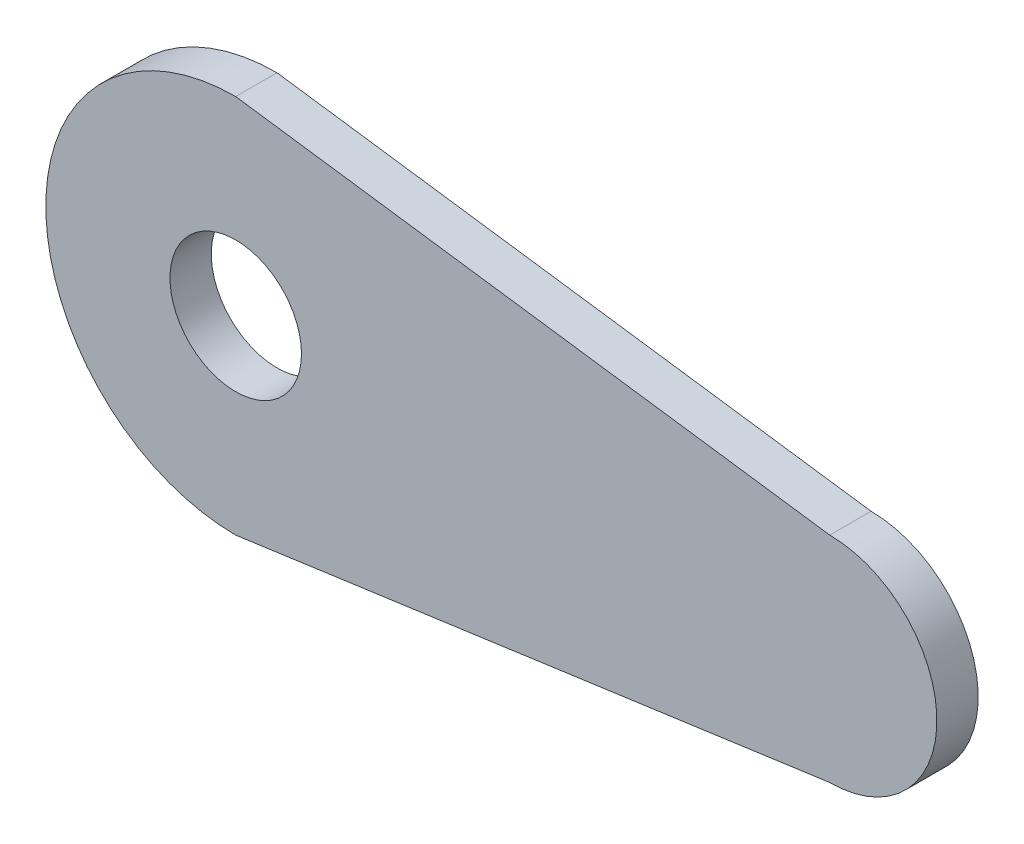
ISO-10303-21;
HEADER;
FILE_DESCRIPTION(('STEP AP214'),'2;1');
FILE_NAME('part.step','',(''),(''),'','','');
FILE_SCHEMA(('AUTOMOTIVE_DESIGN { 1 0 10303 214 1 1 1 1 }'));
ENDSEC;
DATA;
#1=APPLICATION_CONTEXT('core data for automotive mechanical design processes');
#2=APPLICATION_PROTOCOL_DEFINITION('international standard','automotive_design',2000,#1);
#3=PRODUCT_CONTEXT('',#1,'mechanical');
#4=PRODUCT('Part','Part','',(#3));
#5=PRODUCT_RELATED_PRODUCT_CATEGORY('part','',(#4));
#6=PRODUCT_DEFINITION_FORMATION('','',#4);
#7=PRODUCT_DEFINITION_CONTEXT('part definition',#1,'design');
#8=PRODUCT_DEFINITION('design','',#6,#7);
#9=PRODUCT_DEFINITION_SHAPE('','',#8);
#10=(LENGTH_UNIT() NAMED_UNIT(*) SI_UNIT(.MILLI.,.METRE.));
#11=(NAMED_UNIT(*) PLANE_ANGLE_UNIT() SI_UNIT($,.RADIAN.));
#12=(NAMED_UNIT(*) SI_UNIT($,.STERADIAN.) SOLID_ANGLE_UNIT());
#13=UNCERTAINTY_MEASURE_WITH_UNIT(LENGTH_MEASURE(1.E-05),#10,'distance_accuracy_value','');
#14=(GEOMETRIC_REPRESENTATION_CONTEXT(3) GLOBAL_UNCERTAINTY_ASSIGNED_CONTEXT((#13)) GLOBAL_UNIT_ASSIGNED_CONTEXT((#10,
#11,#12)) REPRESENTATION_CONTEXT('',''));
#15=CARTESIAN_POINT('',(0.,0.,0.));
#16=DIRECTION('',(0.,0.,1.));
#17=DIRECTION('',(1.,0.,0.));
#18=AXIS2_PLACEMENT_3D('',#15,#16,#17);
#19=CARTESIAN_POINT('',(15.7169219138927,-112.810291678426,25.));
#20=DIRECTION('',(0.137988919579535,-0.990433772684107,0.));
#21=DIRECTION('',(0.990433772684107,0.137988919579535,0.));
#22=AXIS2_PLACEMENT_3D('',#19,#20,#21);
#23=PLANE('',#22);
#24=DIRECTION('',(-0.990433772684107,-0.137988919579535,0.));
#25=VECTOR('',#24,1.);
#26=CARTESIAN_POINT('',(15.7169219138927,-112.810291678426,0.));
#27=LINE('',#26,#25);
#28=CARTESIAN_POINT('',(359.738611022452,-64.8806042008193,0.));
#29=VERTEX_POINT('',#28);
#30=CARTESIAN_POINT('',(0.,-115.,0.));
#31=VERTEX_POINT('',#30);
#32=EDGE_CURVE('E102',#29,#31,#27,.T.);
#33=ORIENTED_EDGE('',*,*,#32,.F.);
#34=DIRECTION('',(0.,0.,-1.));
#35=VECTOR('',#34,1.);
#36=CARTESIAN_POINT('',(359.738611022452,-64.8806042008193,25.));
#37=LINE('',#36,#35);
#38=CARTESIAN_POINT('',(359.738611022452,-64.8806042008193,25.));
#39=VERTEX_POINT('',#38);
#40=EDGE_CURVE('E11',#39,#29,#37,.T.);
#41=ORIENTED_EDGE('',*,*,#40,.F.);
#42=DIRECTION('',(-0.990433772684107,-0.137988919579535,0.));
#43=VECTOR('',#42,1.);
#44=CARTESIAN_POINT('',(15.7169219138927,-112.810291678426,25.));
#45=LINE('',#44,#43);
#46=CARTESIAN_POINT('',(0.,-115.,25.));
#47=VERTEX_POINT('',#46);
#48=EDGE_CURVE('E84',#39,#47,#45,.T.);
#49=ORIENTED_EDGE('',*,*,#48,.T.);
#50=DIRECTION('',(0.,0.,-1.));
#51=VECTOR('',#50,1.);
#52=CARTESIAN_POINT('',(0.,-115.,25.));
#53=LINE('',#52,#51);
#54=EDGE_CURVE('E73',#47,#31,#53,.T.);
#55=ORIENTED_EDGE('',*,*,#54,.T.);
#56=EDGE_LOOP('',(#33,#41,#49,#55));
#57=FACE_BOUND('',#56,.T.);
#58=ADVANCED_FACE('F35',(#57),#23,.T.);
#59=CARTESIAN_POINT('',(359.738611022452,0.,25.));
#60=DIRECTION('',(0.,0.,-1.));
#61=DIRECTION('',(-1.,0.,0.));
#62=AXIS2_PLACEMENT_3D('',#59,#60,#61);
#63=CYLINDRICAL_SURFACE('',#62,64.8806042008192);
#64=CARTESIAN_POINT('',(359.738611022452,0.,0.));
#65=DIRECTION('',(0.,0.,1.));
#66=DIRECTION('',(1.,0.,0.));
#67=AXIS2_PLACEMENT_3D('',#64,#65,#66);
#68=CIRCLE('',#67,64.8806042008192);
#69=CARTESIAN_POINT('',(359.738611022452,64.8806042008193,0.));
#70=VERTEX_POINT('',#69);
#71=EDGE_CURVE('E90',#29,#70,#68,.T.);
#72=ORIENTED_EDGE('',*,*,#71,.T.);
#73=DIRECTION('',(0.,0.,-1.));
#74=VECTOR('',#73,1.);
#75=CARTESIAN_POINT('',(359.738611022452,64.8806042008193,25.));
#76=LINE('',#75,#74);
#77=CARTESIAN_POINT('',(359.738611022452,64.8806042008193,25.));
#78=VERTEX_POINT('',#77);
#79=EDGE_CURVE('E43',#78,#70,#76,.T.);
#80=ORIENTED_EDGE('',*,*,#79,.F.);
#81=CARTESIAN_POINT('',(359.738611022452,0.,25.));
#82=DIRECTION('',(0.,0.,1.));
#83=DIRECTION('',(1.,0.,0.));
#84=AXIS2_PLACEMENT_3D('',#81,#82,#83);
#85=CIRCLE('',#84,64.8806042008192);
#86=EDGE_CURVE('E78',#39,#78,#85,.T.);
#87=ORIENTED_EDGE('',*,*,#86,.F.);
#88=ORIENTED_EDGE('',*,*,#40,.T.);
#89=EDGE_LOOP('',(#72,#80,#87,#88));
#90=FACE_BOUND('',#89,.T.);
#91=ADVANCED_FACE('F88',(#90),#63,.T.);
#92=CARTESIAN_POINT('',(15.7169219138927,112.810291678426,25.));
#93=DIRECTION('',(0.137988919579535,0.990433772684107,0.));
#94=DIRECTION('',(-0.990433772684107,0.137988919579535,0.));
#95=AXIS2_PLACEMENT_3D('',#92,#93,#94);
#96=PLANE('',#95);
#97=DIRECTION('',(0.990433772684107,-0.137988919579535,0.));
#98=VECTOR('',#97,1.);
#99=CARTESIAN_POINT('',(15.7169219138927,112.810291678426,0.));
#100=LINE('',#99,#98);
#101=CARTESIAN_POINT('',(0.,115.,0.));
#102=VERTEX_POINT('',#101);
#103=EDGE_CURVE('E106',#102,#70,#100,.T.);
#104=ORIENTED_EDGE('',*,*,#103,.F.);
#105=DIRECTION('',(0.,0.,-1.));
#106=VECTOR('',#105,1.);
#107=CARTESIAN_POINT('',(0.,115.,25.));
#108=LINE('',#107,#106);
#109=CARTESIAN_POINT('',(0.,115.,25.));
#110=VERTEX_POINT('',#109);
#111=EDGE_CURVE('E66',#110,#102,#108,.T.);
#112=ORIENTED_EDGE('',*,*,#111,.F.);
#113=DIRECTION('',(0.990433772684107,-0.137988919579535,0.));
#114=VECTOR('',#113,1.);
#115=CARTESIAN_POINT('',(15.7169219138927,112.810291678426,25.));
#116=LINE('',#115,#114);
#117=EDGE_CURVE('E83',#110,#78,#116,.T.);
#118=ORIENTED_EDGE('',*,*,#117,.T.);
#119=ORIENTED_EDGE('',*,*,#79,.T.);
#120=EDGE_LOOP('',(#104,#112,#118,#119));
#121=FACE_BOUND('',#120,.T.);
#122=ADVANCED_FACE('F94',(#121),#96,.T.);
#123=CARTESIAN_POINT('',(0.,0.,25.));
#124=DIRECTION('',(0.,0.,-1.));
#125=DIRECTION('',(-1.,0.,0.));
#126=AXIS2_PLACEMENT_3D('',#123,#124,#125);
#127=CYLINDRICAL_SURFACE('',#126,115.);
#128=CARTESIAN_POINT('',(0.,0.,0.));
#129=DIRECTION('',(0.,0.,1.));
#130=DIRECTION('',(1.,0.,0.));
#131=AXIS2_PLACEMENT_3D('',#128,#129,#130);
#132=CIRCLE('',#131,115.);
#133=EDGE_CURVE('E108',#102,#31,#132,.T.);
#134=ORIENTED_EDGE('',*,*,#133,.T.);
#135=ORIENTED_EDGE('',*,*,#54,.F.);
#136=CARTESIAN_POINT('',(0.,0.,25.));
#137=DIRECTION('',(0.,0.,1.));
#138=DIRECTION('',(1.,0.,0.));
#139=AXIS2_PLACEMENT_3D('',#136,#137,#138);
#140=CIRCLE('',#139,115.);
#141=EDGE_CURVE('E51',#110,#47,#140,.T.);
#142=ORIENTED_EDGE('',*,*,#141,.F.);
#143=ORIENTED_EDGE('',*,*,#111,.T.);
#144=EDGE_LOOP('',(#134,#135,#142,#143));
#145=FACE_BOUND('',#144,.T.);
#146=ADVANCED_FACE('F123',(#145),#127,.T.);
#147=CARTESIAN_POINT('',(0.,0.,25.));
#148=DIRECTION('',(0.,0.,-1.));
#149=DIRECTION('',(-1.,0.,0.));
#150=AXIS2_PLACEMENT_3D('',#147,#148,#149);
#151=CYLINDRICAL_SURFACE('',#150,39.8163956178508);
#152=CARTESIAN_POINT('',(0.,0.,25.));
#153=DIRECTION('',(0.,0.,1.));
#154=DIRECTION('',(1.,0.,0.));
#155=AXIS2_PLACEMENT_3D('',#152,#153,#154);
#156=CIRCLE('',#155,39.8163956178508);
#157=CARTESIAN_POINT('',(39.8163956178508,0.,25.));
#158=VERTEX_POINT('',#157);
#159=EDGE_CURVE('E96',#158,#158,#156,.T.);
#160=ORIENTED_EDGE('',*,*,#159,.T.);
#161=EDGE_LOOP('',(#160));
#162=FACE_BOUND('',#161,.T.);
#163=CARTESIAN_POINT('',(0.,0.,0.));
#164=DIRECTION('',(0.,0.,1.));
#165=DIRECTION('',(1.,0.,0.));
#166=AXIS2_PLACEMENT_3D('',#163,#164,#165);
#167=CIRCLE('',#166,39.8163956178508);
#168=CARTESIAN_POINT('',(39.8163956178508,0.,0.));
#169=VERTEX_POINT('',#168);
#170=EDGE_CURVE('E110',#169,#169,#167,.T.);
#171=ORIENTED_EDGE('',*,*,#170,.F.);
#172=EDGE_LOOP('',(#171));
#173=FACE_BOUND('',#172,.T.);
#174=ADVANCED_FACE('F128',(#162,#173),#151,.F.);
#175=CARTESIAN_POINT('',(0.,0.,25.));
#176=DIRECTION('',(0.,0.,1.));
#177=DIRECTION('',(1.,0.,0.));
#178=AXIS2_PLACEMENT_3D('',#175,#176,#177);
#179=PLANE('',#178);
#180=ORIENTED_EDGE('',*,*,#48,.F.);
#181=ORIENTED_EDGE('',*,*,#86,.T.);
#182=ORIENTED_EDGE('',*,*,#117,.F.);
#183=ORIENTED_EDGE('',*,*,#141,.T.);
#184=EDGE_LOOP('',(#180,#181,#182,#183));
#185=FACE_BOUND('',#184,.T.);
#186=ORIENTED_EDGE('',*,*,#159,.F.);
#187=EDGE_LOOP('',(#186));
#188=FACE_BOUND('',#187,.T.);
#189=ADVANCED_FACE('F80',(#185,#188),#179,.T.);
#190=CARTESIAN_POINT('',(0.,0.,0.));
#191=DIRECTION('',(0.,0.,1.));
#192=DIRECTION('',(1.,0.,0.));
#193=AXIS2_PLACEMENT_3D('',#190,#191,#192);
#194=PLANE('',#193);
#195=ORIENTED_EDGE('',*,*,#32,.T.);
#196=ORIENTED_EDGE('',*,*,#133,.F.);
#197=ORIENTED_EDGE('',*,*,#103,.T.);
#198=ORIENTED_EDGE('',*,*,#71,.F.);
#199=EDGE_LOOP('',(#195,#196,#197,#198));
#200=FACE_BOUND('',#199,.T.);
#201=ORIENTED_EDGE('',*,*,#170,.T.);
#202=EDGE_LOOP('',(#201));
#203=FACE_BOUND('',#202,.T.);
#204=ADVANCED_FACE('F132',(#200,#203),#194,.F.);
#205=CLOSED_SHELL('',(#58,#91,#122,#146,#174,#189,#204));
#206=MANIFOLD_SOLID_BREP('B2',#205);
#207=ADVANCED_BREP_SHAPE_REPRESENTATION('',(#18,#206),#14);
#208=SHAPE_DEFINITION_REPRESENTATION(#9,#207);
ENDSEC;
END-ISO-10303-21;
